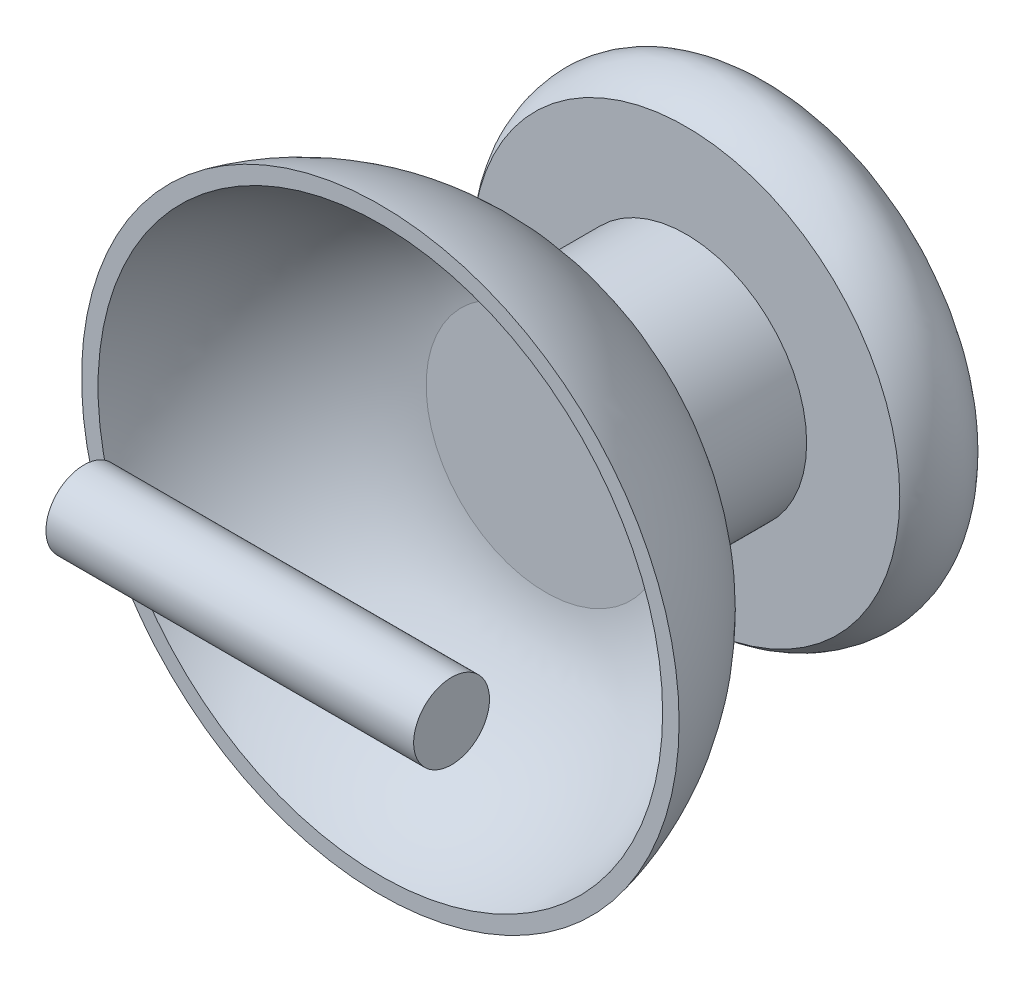
ISO-10303-21;
HEADER;
FILE_DESCRIPTION(('STEP AP214'),'2;1');
FILE_NAME('part.step','',(''),(''),'','','');
FILE_SCHEMA(('AUTOMOTIVE_DESIGN { 1 0 10303 214 1 1 1 1 }'));
ENDSEC;
DATA;
#1=APPLICATION_CONTEXT('core data for automotive mechanical design processes');
#2=APPLICATION_PROTOCOL_DEFINITION('international standard','automotive_design',2000,#1);
#3=PRODUCT_CONTEXT('',#1,'mechanical');
#4=PRODUCT('Part','Part','',(#3));
#5=PRODUCT_RELATED_PRODUCT_CATEGORY('part','',(#4));
#6=PRODUCT_DEFINITION_FORMATION('','',#4);
#7=PRODUCT_DEFINITION_CONTEXT('part definition',#1,'design');
#8=PRODUCT_DEFINITION('design','',#6,#7);
#9=PRODUCT_DEFINITION_SHAPE('','',#8);
#10=(LENGTH_UNIT() NAMED_UNIT(*) SI_UNIT(.MILLI.,.METRE.));
#11=(NAMED_UNIT(*) PLANE_ANGLE_UNIT() SI_UNIT($,.RADIAN.));
#12=(NAMED_UNIT(*) SI_UNIT($,.STERADIAN.) SOLID_ANGLE_UNIT());
#13=UNCERTAINTY_MEASURE_WITH_UNIT(LENGTH_MEASURE(1.E-05),#10,'distance_accuracy_value','');
#14=(GEOMETRIC_REPRESENTATION_CONTEXT(3) GLOBAL_UNCERTAINTY_ASSIGNED_CONTEXT((#13)) GLOBAL_UNIT_ASSIGNED_CONTEXT((#10,
#11,#12)) REPRESENTATION_CONTEXT('',''));
#15=CARTESIAN_POINT('',(0.,0.,0.));
#16=DIRECTION('',(0.,0.,1.));
#17=DIRECTION('',(1.,0.,0.));
#18=AXIS2_PLACEMENT_3D('',#15,#16,#17);
#19=CARTESIAN_POINT('',(8.,0.,4.9));
#20=DIRECTION('',(-1.,0.,0.));
#21=DIRECTION('',(0.,0.,1.));
#22=AXIS2_PLACEMENT_3D('',#19,#20,#21);
#23=CYLINDRICAL_SURFACE('',#22,1.65);
#24=CARTESIAN_POINT('',(8.,0.,4.9));
#25=DIRECTION('',(1.,0.,0.));
#26=DIRECTION('',(0.,0.,-1.));
#27=AXIS2_PLACEMENT_3D('',#24,#25,#26);
#28=CIRCLE('',#27,1.65);
#29=CARTESIAN_POINT('',(8.,0.,3.25));
#30=VERTEX_POINT('',#29);
#31=EDGE_CURVE('E11',#30,#30,#28,.T.);
#32=ORIENTED_EDGE('',*,*,#31,.F.);
#33=EDGE_LOOP('',(#32));
#34=FACE_BOUND('',#33,.T.);
#35=CARTESIAN_POINT('',(-8.,0.,4.9));
#36=DIRECTION('',(1.,0.,0.));
#37=DIRECTION('',(0.,0.,-1.));
#38=AXIS2_PLACEMENT_3D('',#35,#36,#37);
#39=CIRCLE('',#38,1.65);
#40=CARTESIAN_POINT('',(-8.,0.,3.25));
#41=VERTEX_POINT('',#40);
#42=EDGE_CURVE('E55',#41,#41,#39,.T.);
#43=ORIENTED_EDGE('',*,*,#42,.T.);
#44=EDGE_LOOP('',(#43));
#45=FACE_BOUND('',#44,.T.);
#46=ADVANCED_FACE('F52',(#34,#45),#23,.T.);
#47=CARTESIAN_POINT('',(8.,0.,4.9));
#48=DIRECTION('',(1.,0.,0.));
#49=DIRECTION('',(0.,0.,-1.));
#50=AXIS2_PLACEMENT_3D('',#47,#48,#49);
#51=PLANE('',#50);
#52=ORIENTED_EDGE('',*,*,#31,.T.);
#53=EDGE_LOOP('',(#52));
#54=FACE_BOUND('',#53,.T.);
#55=ADVANCED_FACE('F71',(#54),#51,.T.);
#56=CARTESIAN_POINT('',(-8.,0.,4.9));
#57=DIRECTION('',(1.,0.,0.));
#58=DIRECTION('',(0.,0.,-1.));
#59=AXIS2_PLACEMENT_3D('',#56,#57,#58);
#60=PLANE('',#59);
#61=ORIENTED_EDGE('',*,*,#42,.F.);
#62=EDGE_LOOP('',(#61));
#63=FACE_BOUND('',#62,.T.);
#64=ADVANCED_FACE('F69',(#63),#60,.F.);
#65=CLOSED_SHELL('',(#46,#55,#64));
#66=MANIFOLD_SOLID_BREP('B2',#65);
#67=CARTESIAN_POINT('',(-13.,0.,0.));
#68=DIRECTION('',(0.,0.,-1.));
#69=DIRECTION('',(-1.,0.,0.));
#70=AXIS2_PLACEMENT_3D('',#67,#68,#69);
#71=PLANE('',#70);
#72=CARTESIAN_POINT('',(0.,0.,0.));
#73=DIRECTION('',(0.,0.,1.));
#74=DIRECTION('',(1.,0.,0.));
#75=AXIS2_PLACEMENT_3D('',#72,#73,#74);
#76=CIRCLE('',#75,13.);
#77=CARTESIAN_POINT('',(13.,0.,0.));
#78=VERTEX_POINT('',#77);
#79=EDGE_CURVE('E50',#78,#78,#76,.T.);
#80=ORIENTED_EDGE('',*,*,#79,.T.);
#81=EDGE_LOOP('',(#80));
#82=FACE_BOUND('',#81,.T.);
#83=CARTESIAN_POINT('',(0.,0.,0.));
#84=DIRECTION('',(0.,0.,1.));
#85=DIRECTION('',(1.,0.,0.));
#86=AXIS2_PLACEMENT_3D('',#83,#84,#85);
#87=CIRCLE('',#86,12.2829316263153);
#88=CARTESIAN_POINT('',(12.2829316263153,0.,0.));
#89=VERTEX_POINT('',#88);
#90=EDGE_CURVE('E106',#89,#89,#87,.T.);
#91=ORIENTED_EDGE('',*,*,#90,.F.);
#92=EDGE_LOOP('',(#91));
#93=FACE_BOUND('',#92,.T.);
#94=ADVANCED_FACE('F99',(#82,#93),#71,.F.);
#95=CARTESIAN_POINT('',(-5.25,0.,-7.9));
#96=CARTESIAN_POINT('',(-9.18645861072866,0.,-7.4308520861412));
#97=CARTESIAN_POINT('',(-12.2357486735293,0.,-3.58381243368452));
#98=CARTESIAN_POINT('',(-13.,0.,0.));
#99=B_SPLINE_CURVE_WITH_KNOTS('',3,(#95,#96,#97,#98),.UNSPECIFIED.,.F.,.F.,(4,4),(0.,1.),.UNSPECIFIED.);
#100=CARTESIAN_POINT('',(0.,0.,0.));
#101=DIRECTION('',(0.,0.,1.));
#102=AXIS1_PLACEMENT('',#100,#101);
#103=SURFACE_OF_REVOLUTION('',#99,#102);
#104=ORIENTED_EDGE('',*,*,#79,.F.);
#105=EDGE_LOOP('',(#104));
#106=FACE_BOUND('',#105,.T.);
#107=CARTESIAN_POINT('',(0.,0.,-7.9));
#108=DIRECTION('',(0.,0.,-1.));
#109=DIRECTION('',(-1.,0.,0.));
#110=AXIS2_PLACEMENT_3D('',#107,#108,#109);
#111=CIRCLE('',#110,5.25);
#112=CARTESIAN_POINT('',(5.25,0.,-7.9));
#113=VERTEX_POINT('',#112);
#114=EDGE_CURVE('E219',#113,#113,#111,.T.);
#115=ORIENTED_EDGE('',*,*,#114,.F.);
#116=EDGE_LOOP('',(#115));
#117=FACE_BOUND('',#116,.T.);
#118=ADVANCED_FACE('F125',(#106,#117),#103,.T.);
#119=CARTESIAN_POINT('',(-5.25,0.,-7.9));
#120=CARTESIAN_POINT('',(-9.18645861072866,0.,-7.4308520861412));
#121=CARTESIAN_POINT('',(-12.2357486735293,0.,-3.58381243368452));
#122=CARTESIAN_POINT('',(-13.,0.,0.));
#123=B_SPLINE_CURVE_WITH_KNOTS('',3,(#119,#120,#121,#122),.UNSPECIFIED.,.F.,.F.,(4,4),(0.,1.),.UNSPECIFIED.);
#124=CARTESIAN_POINT('',(0.,0.,0.));
#125=DIRECTION('',(0.,0.,1.));
#126=AXIS1_PLACEMENT('',#124,#125);
#127=SURFACE_OF_REVOLUTION('',#123,#126);
#128=OFFSET_SURFACE('',#127,-0.7,.F.);
#129=ORIENTED_EDGE('',*,*,#90,.T.);
#130=EDGE_LOOP('',(#129));
#131=FACE_BOUND('',#130,.T.);
#132=CARTESIAN_POINT('',(0.,0.,-7.2));
#133=DIRECTION('',(0.,0.,1.));
#134=DIRECTION('',(1.,0.,0.));
#135=AXIS2_PLACEMENT_3D('',#132,#133,#134);
#136=CIRCLE('',#135,5.20730424603161);
#137=CARTESIAN_POINT('',(5.20730424603161,0.,-7.2));
#138=VERTEX_POINT('',#137);
#139=EDGE_CURVE('E139',#138,#138,#136,.T.);
#140=ORIENTED_EDGE('',*,*,#139,.F.);
#141=EDGE_LOOP('',(#140));
#142=FACE_BOUND('',#141,.T.);
#143=ADVANCED_FACE('F130',(#131,#142),#128,.F.);
#144=CARTESIAN_POINT('',(0.,0.,-7.2));
#145=DIRECTION('',(0.,0.,1.));
#146=DIRECTION('',(1.,0.,0.));
#147=AXIS2_PLACEMENT_3D('',#144,#145,#146);
#148=PLANE('',#147);
#149=ORIENTED_EDGE('',*,*,#139,.T.);
#150=EDGE_LOOP('',(#149));
#151=FACE_BOUND('',#150,.T.);
#152=ADVANCED_FACE('F156',(#151),#148,.T.);
#153=CARTESIAN_POINT('',(0.,0.,-13.3));
#154=DIRECTION('',(0.,0.,1.));
#155=DIRECTION('',(1.,0.,0.));
#156=AXIS2_PLACEMENT_3D('',#153,#154,#155);
#157=CYLINDRICAL_SURFACE('',#156,5.25);
#158=CARTESIAN_POINT('',(0.,0.,-13.3));
#159=DIRECTION('',(0.,0.,-1.));
#160=DIRECTION('',(-1.,0.,0.));
#161=AXIS2_PLACEMENT_3D('',#158,#159,#160);
#162=CIRCLE('',#161,5.25);
#163=CARTESIAN_POINT('',(5.25,0.,-13.3));
#164=VERTEX_POINT('',#163);
#165=EDGE_CURVE('E145',#164,#164,#162,.T.);
#166=CARTESIAN_POINT('',(5.25,0.,-13.3));
#167=CARTESIAN_POINT('',(5.25,0.,-13.24375));
#168=CARTESIAN_POINT('',(5.25,0.,-13.1875));
#169=CARTESIAN_POINT('',(5.25,0.,-13.075));
#170=CARTESIAN_POINT('',(5.25,0.,-13.01875));
#171=CARTESIAN_POINT('',(5.25,0.,-12.90625));
#172=CARTESIAN_POINT('',(5.25,0.,-12.85));
#173=CARTESIAN_POINT('',(5.25,0.,-12.7375));
#174=CARTESIAN_POINT('',(5.25,0.,-12.68125));
#175=CARTESIAN_POINT('',(5.25,0.,-12.56875));
#176=CARTESIAN_POINT('',(5.25,0.,-12.5125));
#177=CARTESIAN_POINT('',(5.25,0.,-12.4));
#178=CARTESIAN_POINT('',(5.25,0.,-12.34375));
#179=CARTESIAN_POINT('',(5.25,0.,-12.23125));
#180=CARTESIAN_POINT('',(5.25,0.,-12.175));
#181=CARTESIAN_POINT('',(5.25,0.,-12.0625));
#182=CARTESIAN_POINT('',(5.25,0.,-12.00625));
#183=CARTESIAN_POINT('',(5.25,0.,-11.89375));
#184=CARTESIAN_POINT('',(5.25,0.,-11.8375));
#185=CARTESIAN_POINT('',(5.25,0.,-11.725));
#186=CARTESIAN_POINT('',(5.25,0.,-11.66875));
#187=CARTESIAN_POINT('',(5.25,0.,-11.55625));
#188=CARTESIAN_POINT('',(5.25,0.,-11.5));
#189=CARTESIAN_POINT('',(5.25,0.,-11.3875));
#190=CARTESIAN_POINT('',(5.25,0.,-11.33125));
#191=CARTESIAN_POINT('',(5.25,0.,-11.21875));
#192=CARTESIAN_POINT('',(5.25,0.,-11.1625));
#193=CARTESIAN_POINT('',(5.25,0.,-11.05));
#194=CARTESIAN_POINT('',(5.25,0.,-10.99375));
#195=CARTESIAN_POINT('',(5.25,0.,-10.88125));
#196=CARTESIAN_POINT('',(5.25,0.,-10.825));
#197=CARTESIAN_POINT('',(5.25,0.,-10.7125));
#198=CARTESIAN_POINT('',(5.25,0.,-10.65625));
#199=CARTESIAN_POINT('',(5.25,0.,-10.54375));
#200=CARTESIAN_POINT('',(5.25,0.,-10.4875));
#201=CARTESIAN_POINT('',(5.25,0.,-10.375));
#202=CARTESIAN_POINT('',(5.25,0.,-10.31875));
#203=CARTESIAN_POINT('',(5.25,0.,-10.20625));
#204=CARTESIAN_POINT('',(5.25,0.,-10.15));
#205=CARTESIAN_POINT('',(5.25,0.,-10.0375));
#206=CARTESIAN_POINT('',(5.25,0.,-9.98125));
#207=CARTESIAN_POINT('',(5.25,0.,-9.86875));
#208=CARTESIAN_POINT('',(5.25,0.,-9.8125));
#209=CARTESIAN_POINT('',(5.25,0.,-9.7));
#210=CARTESIAN_POINT('',(5.25,0.,-9.64375));
#211=CARTESIAN_POINT('',(5.25,0.,-9.53125));
#212=CARTESIAN_POINT('',(5.25,0.,-9.475));
#213=CARTESIAN_POINT('',(5.25,0.,-9.3625));
#214=CARTESIAN_POINT('',(5.25,0.,-9.30625));
#215=CARTESIAN_POINT('',(5.25,0.,-9.19375));
#216=CARTESIAN_POINT('',(5.25,0.,-9.1375));
#217=CARTESIAN_POINT('',(5.25,0.,-9.025));
#218=CARTESIAN_POINT('',(5.25,0.,-8.96875));
#219=CARTESIAN_POINT('',(5.25,0.,-8.85625));
#220=CARTESIAN_POINT('',(5.25,0.,-8.8));
#221=CARTESIAN_POINT('',(5.25,0.,-8.6875));
#222=CARTESIAN_POINT('',(5.25,0.,-8.63125));
#223=CARTESIAN_POINT('',(5.25,0.,-8.51875));
#224=CARTESIAN_POINT('',(5.25,0.,-8.4625));
#225=CARTESIAN_POINT('',(5.25,0.,-8.35));
#226=CARTESIAN_POINT('',(5.25,0.,-8.29375));
#227=CARTESIAN_POINT('',(5.25,0.,-8.18125));
#228=CARTESIAN_POINT('',(5.25,0.,-8.125));
#229=CARTESIAN_POINT('',(5.25,0.,-8.0125));
#230=CARTESIAN_POINT('',(5.25,0.,-7.95625));
#231=CARTESIAN_POINT('',(5.25,0.,-7.9));
#232=B_SPLINE_CURVE_WITH_KNOTS('',3,(#166,#167,#168,#169,#170,#171,#172,#173,#174,#175,#176,
#177,#178,#179,#180,#181,#182,#183,#184,#185,#186,#187,#188,#189,#190,#191,#192,#193,#194,#195,
#196,#197,#198,#199,#200,#201,#202,#203,#204,#205,#206,#207,#208,#209,#210,#211,#212,#213,#214,
#215,#216,#217,#218,#219,#220,#221,#222,#223,#224,#225,#226,#227,#228,#229,#230,#231),
.UNSPECIFIED.,.F.,.F.,(4,2,2,2,2,2,2,2,2,2,2,2,2,2,2,2,2,2,2,2,2,2,2,2,2,2,2,2,2,2,2,2,4),(0.,
0.168749999999999,0.337499999999999,0.50625,0.674999999999998,0.843749999999999,1.0125,1.18125,
1.35,1.51875,1.6875,1.85625,2.025,2.19375,2.3625,2.53125,2.7,2.86875,3.0375,3.20625,3.375,
3.54375,3.7125,3.88125,4.05,4.21875,4.3875,4.55625,4.725,4.89375,5.0625,5.23125,5.4),.UNSPECIFIED.);
#233=EDGE_CURVE('BSEAM118',#164,#113,#232,.T.);
#234=ORIENTED_EDGE('',*,*,#165,.F.);
#235=ORIENTED_EDGE('',*,*,#114,.T.);
#236=ORIENTED_EDGE('',*,*,#233,.T.);
#237=ORIENTED_EDGE('',*,*,#233,.F.);
#238=EDGE_LOOP('',(#234,#236,#235,#237));
#239=FACE_BOUND('',#238,.T.);
#240=ADVANCED_FACE('F118',(#239),#157,.T.);
#241=CARTESIAN_POINT('',(0.,0.,-13.3));
#242=DIRECTION('',(0.,0.,-1.));
#243=DIRECTION('',(-1.,0.,0.));
#244=AXIS2_PLACEMENT_3D('',#241,#242,#243);
#245=PLANE('',#244);
#246=CARTESIAN_POINT('',(0.,0.,-13.3));
#247=DIRECTION('',(0.,0.,1.));
#248=DIRECTION('',(1.,0.,0.));
#249=AXIS2_PLACEMENT_3D('',#246,#247,#248);
#250=CIRCLE('',#249,9.3);
#251=CARTESIAN_POINT('',(9.3,0.,-13.3));
#252=VERTEX_POINT('',#251);
#253=EDGE_CURVE('E221',#252,#252,#250,.T.);
#254=ORIENTED_EDGE('',*,*,#253,.T.);
#255=EDGE_LOOP('',(#254));
#256=FACE_BOUND('',#255,.T.);
#257=ORIENTED_EDGE('',*,*,#165,.T.);
#258=EDGE_LOOP('',(#257));
#259=FACE_BOUND('',#258,.T.);
#260=ADVANCED_FACE('F112',(#256,#259),#245,.F.);
#261=CARTESIAN_POINT('',(0.,0.,-18.6));
#262=CARTESIAN_POINT('',(-3.38907727397138,0.,-18.6));
#263=CARTESIAN_POINT('',(-8.02191697698047,0.,-17.9207927120698));
#264=CARTESIAN_POINT('',(-9.73103169843932,0.,-16.3088497239293));
#265=CARTESIAN_POINT('',(-10.2242142411225,0.,-15.1804372025924));
#266=CARTESIAN_POINT('',(-9.73623574547027,0.,-13.7550036306002));
#267=CARTESIAN_POINT('',(-9.3,0.,-13.3));
#268=B_SPLINE_CURVE_WITH_KNOTS('',3,(#261,#262,#263,#264,#265,#266,#267),.UNSPECIFIED.,.F.,.F.,
(4,1,1,1,4),(0.,0.510610241660633,0.588924743373367,0.783145017127343,1.),.UNSPECIFIED.);
#269=CARTESIAN_POINT('',(0.,0.,0.));
#270=DIRECTION('',(0.,0.,1.));
#271=AXIS1_PLACEMENT('',#269,#270);
#272=SURFACE_OF_REVOLUTION('',#268,#271);
#273=ORIENTED_EDGE('',*,*,#253,.F.);
#274=EDGE_LOOP('',(#273));
#275=FACE_BOUND('',#274,.T.);
#276=CARTESIAN_POINT('',(0.,0.,-18.6));
#277=VERTEX_POINT('',#276);
#278=VERTEX_LOOP('',#277);
#279=FACE_BOUND('',#278,.T.);
#280=ADVANCED_FACE('F110',(#275,#279),#272,.T.);
#281=CLOSED_SHELL('',(#94,#118,#143,#152,#240,#260,#280));
#282=MANIFOLD_SOLID_BREP('B6',#281);
#283=ADVANCED_BREP_SHAPE_REPRESENTATION('',(#18,#66,#282),#14);
#284=SHAPE_DEFINITION_REPRESENTATION(#9,#283);
ENDSEC;
END-ISO-10303-21;
